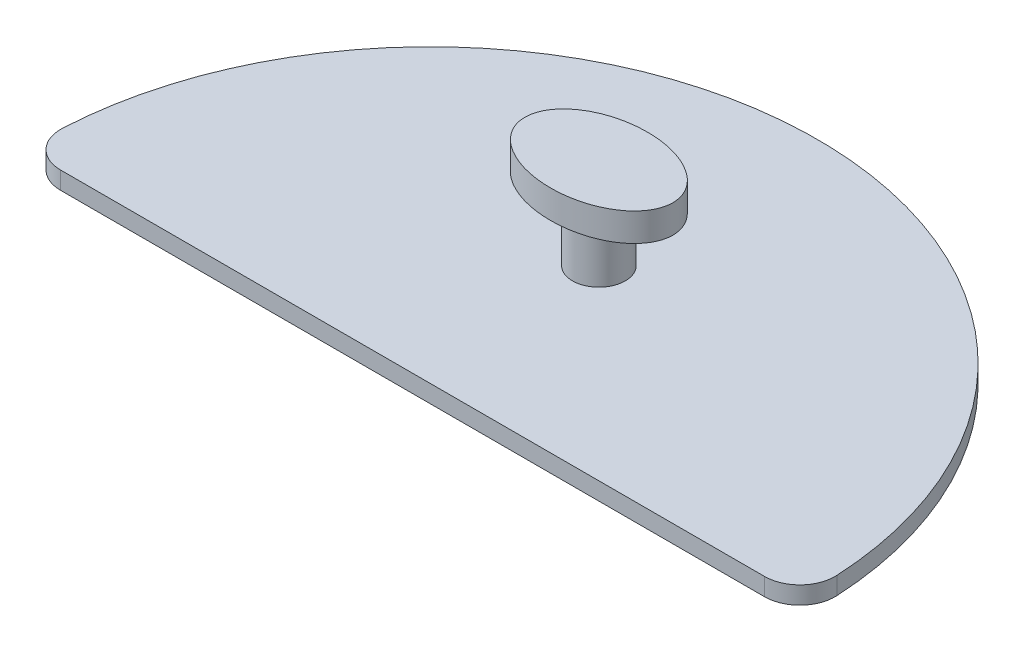
ISO-10303-21;
HEADER;
FILE_DESCRIPTION(('STEP AP214'),'2;1');
FILE_NAME('part.step','',(''),(''),'','','');
FILE_SCHEMA(('AUTOMOTIVE_DESIGN { 1 0 10303 214 1 1 1 1 }'));
ENDSEC;
DATA;
#1=APPLICATION_CONTEXT('core data for automotive mechanical design processes');
#2=APPLICATION_PROTOCOL_DEFINITION('international standard','automotive_design',2000,#1);
#3=PRODUCT_CONTEXT('',#1,'mechanical');
#4=PRODUCT('Part','Part','',(#3));
#5=PRODUCT_RELATED_PRODUCT_CATEGORY('part','',(#4));
#6=PRODUCT_DEFINITION_FORMATION('','',#4);
#7=PRODUCT_DEFINITION_CONTEXT('part definition',#1,'design');
#8=PRODUCT_DEFINITION('design','',#6,#7);
#9=PRODUCT_DEFINITION_SHAPE('','',#8);
#10=(LENGTH_UNIT() NAMED_UNIT(*) SI_UNIT(.MILLI.,.METRE.));
#11=(NAMED_UNIT(*) PLANE_ANGLE_UNIT() SI_UNIT($,.RADIAN.));
#12=(NAMED_UNIT(*) SI_UNIT($,.STERADIAN.) SOLID_ANGLE_UNIT());
#13=UNCERTAINTY_MEASURE_WITH_UNIT(LENGTH_MEASURE(1.E-05),#10,'distance_accuracy_value','');
#14=(GEOMETRIC_REPRESENTATION_CONTEXT(3) GLOBAL_UNCERTAINTY_ASSIGNED_CONTEXT((#13)) GLOBAL_UNIT_ASSIGNED_CONTEXT((#10,
#11,#12)) REPRESENTATION_CONTEXT('',''));
#15=CARTESIAN_POINT('',(0.,0.,0.));
#16=DIRECTION('',(0.,0.,1.));
#17=DIRECTION('',(1.,0.,0.));
#18=AXIS2_PLACEMENT_3D('',#15,#16,#17);
#19=CARTESIAN_POINT('',(110.,0.,-4.89130434782603));
#20=DIRECTION('',(0.,-1.,0.));
#21=DIRECTION('',(0.,0.,-1.));
#22=AXIS2_PLACEMENT_3D('',#19,#20,#21);
#23=PLANE('',#22);
#24=CARTESIAN_POINT('',(110.,0.,-4.89130434782603));
#25=DIRECTION('',(0.,1.,0.));
#26=DIRECTION('',(0.,0.,-1.));
#27=AXIS2_PLACEMENT_3D('',#24,#25,#26);
#28=CIRCLE('',#27,110.108695652174);
#29=CARTESIAN_POINT('',(219.965228954052,0.,-10.5103148751357));
#30=VERTEX_POINT('',#29);
#31=CARTESIAN_POINT('',(0.0347710459481648,0.,-10.5103148751357));
#32=VERTEX_POINT('',#31);
#33=EDGE_CURVE('E128',#30,#32,#28,.T.);
#34=ORIENTED_EDGE('',*,*,#33,.F.);
#35=CARTESIAN_POINT('',(209.978258506102,0.,-10.));
#36=DIRECTION('',(0.,-1.,0.));
#37=DIRECTION('',(0.,0.,-1.));
#38=AXIS2_PLACEMENT_3D('',#35,#36,#37);
#39=CIRCLE('',#38,10.);
#40=CARTESIAN_POINT('',(209.978258506102,0.,0.));
#41=VERTEX_POINT('',#40);
#42=EDGE_CURVE('E156',#30,#41,#39,.T.);
#43=ORIENTED_EDGE('',*,*,#42,.T.);
#44=DIRECTION('',(1.,0.,0.));
#45=VECTOR('',#44,1.);
#46=CARTESIAN_POINT('',(0.,0.,0.));
#47=LINE('',#46,#45);
#48=CARTESIAN_POINT('',(10.0217414938976,0.,0.));
#49=VERTEX_POINT('',#48);
#50=EDGE_CURVE('E134',#49,#41,#47,.T.);
#51=ORIENTED_EDGE('',*,*,#50,.F.);
#52=CARTESIAN_POINT('',(10.0217414938976,0.,-10.));
#53=DIRECTION('',(0.,-1.,0.));
#54=DIRECTION('',(0.,0.,-1.));
#55=AXIS2_PLACEMENT_3D('',#52,#53,#54);
#56=CIRCLE('',#55,10.);
#57=EDGE_CURVE('E153',#49,#32,#56,.T.);
#58=ORIENTED_EDGE('',*,*,#57,.T.);
#59=EDGE_LOOP('',(#34,#43,#51,#58));
#60=FACE_BOUND('',#59,.T.);
#61=DIRECTION('',(1.,0.,0.));
#62=VECTOR('',#61,1.);
#63=CARTESIAN_POINT('',(21.6440376185734,0.,-15.8117346562076));
#64=LINE('',#63,#62);
#65=CARTESIAN_POINT('',(21.6440376185734,0.,-15.8117346562076));
#66=VERTEX_POINT('',#65);
#67=CARTESIAN_POINT('',(196.039947640105,0.,-15.8117346562076));
#68=VERTEX_POINT('',#67);
#69=EDGE_CURVE('E104',#66,#68,#64,.T.);
#70=ORIENTED_EDGE('',*,*,#69,.T.);
#71=CARTESIAN_POINT('',(108.841992629339,0.,-4.05584153783354));
#72=DIRECTION('',(0.,1.,0.));
#73=DIRECTION('',(0.,0.,-1.));
#74=AXIS2_PLACEMENT_3D('',#71,#72,#73);
#75=CIRCLE('',#74,87.9868420905658);
#76=EDGE_CURVE('E121',#68,#66,#75,.T.);
#77=ORIENTED_EDGE('',*,*,#76,.T.);
#78=EDGE_LOOP('',(#70,#77));
#79=FACE_BOUND('',#78,.T.);
#80=ADVANCED_FACE('F43',(#60,#79),#23,.T.);
#81=CARTESIAN_POINT('',(110.,5.,-4.89130434782603));
#82=DIRECTION('',(0.,-1.,0.));
#83=DIRECTION('',(0.,0.,-1.));
#84=AXIS2_PLACEMENT_3D('',#81,#82,#83);
#85=CYLINDRICAL_SURFACE('',#84,110.108695652174);
#86=CARTESIAN_POINT('',(110.,5.,-4.89130434782603));
#87=DIRECTION('',(0.,1.,0.));
#88=DIRECTION('',(0.,0.,-1.));
#89=AXIS2_PLACEMENT_3D('',#86,#87,#88);
#90=CIRCLE('',#89,110.108695652174);
#91=CARTESIAN_POINT('',(219.965228954052,5.,-10.5103148751357));
#92=VERTEX_POINT('',#91);
#93=CARTESIAN_POINT('',(0.0347710459481648,5.,-10.5103148751357));
#94=VERTEX_POINT('',#93);
#95=EDGE_CURVE('E130',#92,#94,#90,.T.);
#96=ORIENTED_EDGE('',*,*,#95,.F.);
#97=DIRECTION('',(0.,-1.,0.));
#98=VECTOR('',#97,1.);
#99=CARTESIAN_POINT('',(219.965228954052,5.,-10.5103148751357));
#100=LINE('',#99,#98);
#101=EDGE_CURVE('E149',#92,#30,#100,.T.);
#102=ORIENTED_EDGE('',*,*,#101,.T.);
#103=ORIENTED_EDGE('',*,*,#33,.T.);
#104=DIRECTION('',(0.,-1.,0.));
#105=VECTOR('',#104,1.);
#106=CARTESIAN_POINT('',(0.0347710459481648,5.,-10.5103148751357));
#107=LINE('',#106,#105);
#108=EDGE_CURVE('E146',#32,#94,#107,.F.);
#109=ORIENTED_EDGE('',*,*,#108,.T.);
#110=EDGE_LOOP('',(#96,#102,#103,#109));
#111=FACE_BOUND('',#110,.T.);
#112=ADVANCED_FACE('F178',(#111),#85,.T.);
#113=CARTESIAN_POINT('',(0.,5.,0.));
#114=DIRECTION('',(0.,0.,-1.));
#115=DIRECTION('',(-1.,0.,0.));
#116=AXIS2_PLACEMENT_3D('',#113,#114,#115);
#117=PLANE('',#116);
#118=ORIENTED_EDGE('',*,*,#50,.T.);
#119=DIRECTION('',(0.,-1.,0.));
#120=VECTOR('',#119,1.);
#121=CARTESIAN_POINT('',(209.978258506102,5.,0.));
#122=LINE('',#121,#120);
#123=CARTESIAN_POINT('',(209.978258506102,5.,0.));
#124=VERTEX_POINT('',#123);
#125=EDGE_CURVE('E59',#41,#124,#122,.F.);
#126=ORIENTED_EDGE('',*,*,#125,.T.);
#127=DIRECTION('',(1.,0.,0.));
#128=VECTOR('',#127,1.);
#129=CARTESIAN_POINT('',(0.,5.,0.));
#130=LINE('',#129,#128);
#131=CARTESIAN_POINT('',(10.0217414938976,5.,0.));
#132=VERTEX_POINT('',#131);
#133=EDGE_CURVE('E133',#132,#124,#130,.T.);
#134=ORIENTED_EDGE('',*,*,#133,.F.);
#135=DIRECTION('',(0.,-1.,0.));
#136=VECTOR('',#135,1.);
#137=CARTESIAN_POINT('',(10.0217414938976,5.,0.));
#138=LINE('',#137,#136);
#139=EDGE_CURVE('E159',#132,#49,#138,.T.);
#140=ORIENTED_EDGE('',*,*,#139,.T.);
#141=EDGE_LOOP('',(#118,#126,#134,#140));
#142=FACE_BOUND('',#141,.T.);
#143=ADVANCED_FACE('F167',(#142),#117,.F.);
#144=CARTESIAN_POINT('',(110.,5.,-4.89130434782603));
#145=DIRECTION('',(0.,-1.,0.));
#146=DIRECTION('',(0.,0.,-1.));
#147=AXIS2_PLACEMENT_3D('',#144,#145,#146);
#148=PLANE('',#147);
#149=CARTESIAN_POINT('',(110.,5.,-52.9142908121829));
#150=DIRECTION('',(0.,-1.,0.));
#151=DIRECTION('',(0.,0.,-1.));
#152=AXIS2_PLACEMENT_3D('',#149,#150,#151);
#153=CIRCLE('',#152,7.50000000000001);
#154=CARTESIAN_POINT('',(110.,5.,-60.4142908121829));
#155=VERTEX_POINT('',#154);
#156=EDGE_CURVE('E137',#155,#155,#153,.F.);
#157=ORIENTED_EDGE('',*,*,#156,.F.);
#158=EDGE_LOOP('',(#157));
#159=FACE_BOUND('',#158,.T.);
#160=ORIENTED_EDGE('',*,*,#133,.T.);
#161=CARTESIAN_POINT('',(209.978258506102,5.,-10.));
#162=DIRECTION('',(0.,-1.,0.));
#163=DIRECTION('',(0.,0.,-1.));
#164=AXIS2_PLACEMENT_3D('',#161,#162,#163);
#165=CIRCLE('',#164,10.);
#166=EDGE_CURVE('E11',#124,#92,#165,.F.);
#167=ORIENTED_EDGE('',*,*,#166,.T.);
#168=ORIENTED_EDGE('',*,*,#95,.T.);
#169=CARTESIAN_POINT('',(10.0217414938976,5.,-10.));
#170=DIRECTION('',(0.,-1.,0.));
#171=DIRECTION('',(0.,0.,-1.));
#172=AXIS2_PLACEMENT_3D('',#169,#170,#171);
#173=CIRCLE('',#172,10.);
#174=EDGE_CURVE('E52',#94,#132,#173,.F.);
#175=ORIENTED_EDGE('',*,*,#174,.T.);
#176=EDGE_LOOP('',(#160,#167,#168,#175));
#177=FACE_BOUND('',#176,.T.);
#178=ADVANCED_FACE('F180',(#159,#177),#148,.F.);
#179=CARTESIAN_POINT('',(108.841992629339,-5.,-4.05584153783354));
#180=DIRECTION('',(0.,1.,0.));
#181=DIRECTION('',(0.,0.,1.));
#182=AXIS2_PLACEMENT_3D('',#179,#180,#181);
#183=CYLINDRICAL_SURFACE('',#182,87.9868420905658);
#184=ORIENTED_EDGE('',*,*,#76,.F.);
#185=DIRECTION('',(0.,1.,0.));
#186=VECTOR('',#185,1.);
#187=CARTESIAN_POINT('',(196.039947640105,-5.,-15.8117346562076));
#188=LINE('',#187,#186);
#189=CARTESIAN_POINT('',(196.039947640105,-5.,-15.8117346562076));
#190=VERTEX_POINT('',#189);
#191=EDGE_CURVE('E108',#190,#68,#188,.T.);
#192=ORIENTED_EDGE('',*,*,#191,.F.);
#193=CARTESIAN_POINT('',(108.841992629339,-5.,-4.05584153783354));
#194=DIRECTION('',(0.,1.,0.));
#195=DIRECTION('',(0.,0.,-1.));
#196=AXIS2_PLACEMENT_3D('',#193,#194,#195);
#197=CIRCLE('',#196,87.9868420905658);
#198=CARTESIAN_POINT('',(21.6440376185734,-5.,-15.8117346562076));
#199=VERTEX_POINT('',#198);
#200=EDGE_CURVE('E111',#190,#199,#197,.T.);
#201=ORIENTED_EDGE('',*,*,#200,.T.);
#202=DIRECTION('',(0.,1.,0.));
#203=VECTOR('',#202,1.);
#204=CARTESIAN_POINT('',(21.6440376185734,-5.,-15.8117346562076));
#205=LINE('',#204,#203);
#206=EDGE_CURVE('E97',#199,#66,#205,.T.);
#207=ORIENTED_EDGE('',*,*,#206,.T.);
#208=EDGE_LOOP('',(#184,#192,#201,#207));
#209=FACE_BOUND('',#208,.T.);
#210=ADVANCED_FACE('F112',(#209),#183,.T.);
#211=CARTESIAN_POINT('',(21.6440376185734,-5.,-15.8117346562076));
#212=DIRECTION('',(0.,0.,1.));
#213=DIRECTION('',(1.,0.,0.));
#214=AXIS2_PLACEMENT_3D('',#211,#212,#213);
#215=PLANE('',#214);
#216=ORIENTED_EDGE('',*,*,#69,.F.);
#217=ORIENTED_EDGE('',*,*,#206,.F.);
#218=DIRECTION('',(1.,0.,0.));
#219=VECTOR('',#218,1.);
#220=CARTESIAN_POINT('',(21.6440376185734,-5.,-15.8117346562076));
#221=LINE('',#220,#219);
#222=EDGE_CURVE('E102',#199,#190,#221,.T.);
#223=ORIENTED_EDGE('',*,*,#222,.T.);
#224=ORIENTED_EDGE('',*,*,#191,.T.);
#225=EDGE_LOOP('',(#216,#217,#223,#224));
#226=FACE_BOUND('',#225,.T.);
#227=ADVANCED_FACE('F99',(#226),#215,.T.);
#228=CARTESIAN_POINT('',(108.841992629339,-5.,-4.05584153783354));
#229=DIRECTION('',(0.,-1.,0.));
#230=DIRECTION('',(0.,0.,-1.));
#231=AXIS2_PLACEMENT_3D('',#228,#229,#230);
#232=PLANE('',#231);
#233=ORIENTED_EDGE('',*,*,#200,.F.);
#234=ORIENTED_EDGE('',*,*,#222,.F.);
#235=EDGE_LOOP('',(#233,#234));
#236=FACE_BOUND('',#235,.T.);
#237=ADVANCED_FACE('F116',(#236),#232,.T.);
#238=CARTESIAN_POINT('',(110.,23.,-52.9142908121829));
#239=DIRECTION('',(0.,-1.,0.));
#240=DIRECTION('',(0.,0.,-1.));
#241=AXIS2_PLACEMENT_3D('',#238,#239,#240);
#242=CYLINDRICAL_SURFACE('',#241,7.50000000000001);
#243=CARTESIAN_POINT('',(110.,23.,-52.9142908121829));
#244=DIRECTION('',(0.,1.,0.));
#245=DIRECTION('',(0.,0.,1.));
#246=AXIS2_PLACEMENT_3D('',#243,#244,#245);
#247=CIRCLE('',#246,7.50000000000001);
#248=CARTESIAN_POINT('',(110.,23.,-45.4142908121828));
#249=VERTEX_POINT('',#248);
#250=EDGE_CURVE('E124',#249,#249,#247,.T.);
#251=ORIENTED_EDGE('',*,*,#250,.F.);
#252=EDGE_LOOP('',(#251));
#253=FACE_BOUND('',#252,.T.);
#254=ORIENTED_EDGE('',*,*,#156,.T.);
#255=EDGE_LOOP('',(#254));
#256=FACE_BOUND('',#255,.T.);
#257=ADVANCED_FACE('F205',(#253,#256),#242,.T.);
#258=CARTESIAN_POINT('',(110.,31.,-52.9142908121829));
#259=DIRECTION('',(0.,1.,0.));
#260=DIRECTION('',(1.,0.,0.));
#261=AXIS2_PLACEMENT_3D('',#258,#259,#260);
#262=ELLIPSE('',#261,21.0178337774954,13.7571275634515);
#263=DIRECTION('',(0.,-1.,0.));
#264=VECTOR('',#263,1.);
#265=SURFACE_OF_LINEAR_EXTRUSION('',#262,#264);
#266=CARTESIAN_POINT('',(131.017833777495,31.,-52.9142908121829));
#267=VERTEX_POINT('',#266);
#268=EDGE_CURVE('E329',#267,#267,#262,.T.);
#269=ORIENTED_EDGE('',*,*,#268,.F.);
#270=EDGE_LOOP('',(#269));
#271=FACE_BOUND('',#270,.T.);
#272=CARTESIAN_POINT('',(110.,23.,-52.9142908121829));
#273=DIRECTION('',(0.,1.,0.));
#274=DIRECTION('',(1.,0.,0.));
#275=AXIS2_PLACEMENT_3D('',#272,#273,#274);
#276=ELLIPSE('',#275,21.0178337774954,13.7571275634515);
#277=CARTESIAN_POINT('',(131.017833777495,23.,-52.9142908121829));
#278=VERTEX_POINT('',#277);
#279=EDGE_CURVE('E326',#278,#278,#276,.T.);
#280=ORIENTED_EDGE('',*,*,#279,.T.);
#281=EDGE_LOOP('',(#280));
#282=FACE_BOUND('',#281,.T.);
#283=ADVANCED_FACE('F207',(#271,#282),#265,.F.);
#284=CARTESIAN_POINT('',(110.,31.,-52.9142908121829));
#285=DIRECTION('',(0.,1.,0.));
#286=DIRECTION('',(0.,0.,1.));
#287=AXIS2_PLACEMENT_3D('',#284,#285,#286);
#288=PLANE('',#287);
#289=ORIENTED_EDGE('',*,*,#268,.T.);
#290=EDGE_LOOP('',(#289));
#291=FACE_BOUND('',#290,.T.);
#292=ADVANCED_FACE('F214',(#291),#288,.T.);
#293=CARTESIAN_POINT('',(110.,23.,-52.9142908121829));
#294=DIRECTION('',(0.,1.,0.));
#295=DIRECTION('',(0.,0.,1.));
#296=AXIS2_PLACEMENT_3D('',#293,#294,#295);
#297=PLANE('',#296);
#298=ORIENTED_EDGE('',*,*,#250,.T.);
#299=EDGE_LOOP('',(#298));
#300=FACE_BOUND('',#299,.T.);
#301=ORIENTED_EDGE('',*,*,#279,.F.);
#302=EDGE_LOOP('',(#301));
#303=FACE_BOUND('',#302,.T.);
#304=ADVANCED_FACE('F185',(#300,#303),#297,.F.);
#305=CARTESIAN_POINT('',(209.978258506102,5.,-10.));
#306=DIRECTION('',(0.,-1.,0.));
#307=DIRECTION('',(0.,0.,-1.));
#308=AXIS2_PLACEMENT_3D('',#305,#306,#307);
#309=CYLINDRICAL_SURFACE('',#308,10.);
#310=ORIENTED_EDGE('',*,*,#166,.F.);
#311=ORIENTED_EDGE('',*,*,#125,.F.);
#312=ORIENTED_EDGE('',*,*,#42,.F.);
#313=ORIENTED_EDGE('',*,*,#101,.F.);
#314=EDGE_LOOP('',(#310,#311,#312,#313));
#315=FACE_BOUND('',#314,.T.);
#316=ADVANCED_FACE('F175',(#315),#309,.T.);
#317=CARTESIAN_POINT('',(10.0217414938976,5.,-10.));
#318=DIRECTION('',(0.,-1.,0.));
#319=DIRECTION('',(0.,0.,-1.));
#320=AXIS2_PLACEMENT_3D('',#317,#318,#319);
#321=CYLINDRICAL_SURFACE('',#320,10.);
#322=ORIENTED_EDGE('',*,*,#174,.F.);
#323=ORIENTED_EDGE('',*,*,#108,.F.);
#324=ORIENTED_EDGE('',*,*,#57,.F.);
#325=ORIENTED_EDGE('',*,*,#139,.F.);
#326=EDGE_LOOP('',(#322,#323,#324,#325));
#327=FACE_BOUND('',#326,.T.);
#328=ADVANCED_FACE('F45',(#327),#321,.T.);
#329=CLOSED_SHELL('',(#80,#112,#143,#178,#210,#227,#237,#257,#283,#292,#304,#316,#328));
#330=MANIFOLD_SOLID_BREP('B2',#329);
#331=ADVANCED_BREP_SHAPE_REPRESENTATION('',(#18,#330),#14);
#332=SHAPE_DEFINITION_REPRESENTATION(#9,#331);
ENDSEC;
END-ISO-10303-21;
